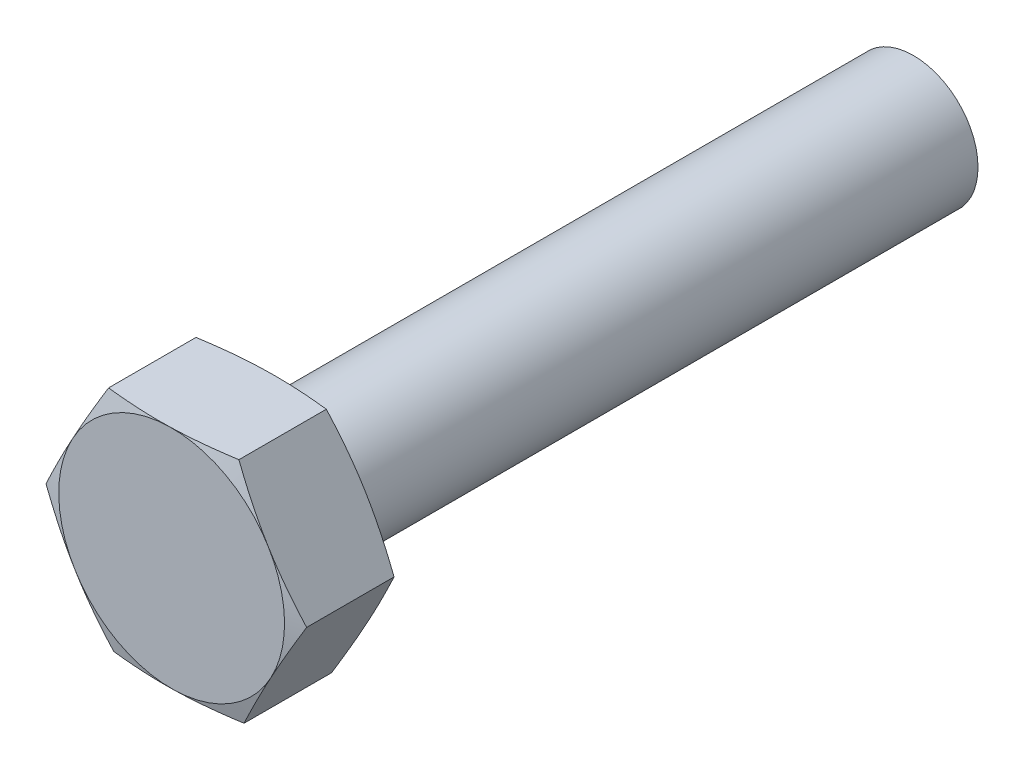
ISO-10303-21;
HEADER;
FILE_DESCRIPTION(('STEP AP214'),'2;1');
FILE_NAME('part.step','',(''),(''),'','','');
FILE_SCHEMA(('AUTOMOTIVE_DESIGN { 1 0 10303 214 1 1 1 1 }'));
ENDSEC;
DATA;
#1=APPLICATION_CONTEXT('core data for automotive mechanical design processes');
#2=APPLICATION_PROTOCOL_DEFINITION('international standard','automotive_design',2000,#1);
#3=PRODUCT_CONTEXT('',#1,'mechanical');
#4=PRODUCT('Part','Part','',(#3));
#5=PRODUCT_RELATED_PRODUCT_CATEGORY('part','',(#4));
#6=PRODUCT_DEFINITION_FORMATION('','',#4);
#7=PRODUCT_DEFINITION_CONTEXT('part definition',#1,'design');
#8=PRODUCT_DEFINITION('design','',#6,#7);
#9=PRODUCT_DEFINITION_SHAPE('','',#8);
#10=(LENGTH_UNIT() NAMED_UNIT(*) SI_UNIT(.MILLI.,.METRE.));
#11=(NAMED_UNIT(*) PLANE_ANGLE_UNIT() SI_UNIT($,.RADIAN.));
#12=(NAMED_UNIT(*) SI_UNIT($,.STERADIAN.) SOLID_ANGLE_UNIT());
#13=UNCERTAINTY_MEASURE_WITH_UNIT(LENGTH_MEASURE(1.E-05),#10,'distance_accuracy_value','');
#14=(GEOMETRIC_REPRESENTATION_CONTEXT(3) GLOBAL_UNCERTAINTY_ASSIGNED_CONTEXT((#13)) GLOBAL_UNIT_ASSIGNED_CONTEXT((#10,
#11,#12)) REPRESENTATION_CONTEXT('',''));
#15=CARTESIAN_POINT('',(0.,0.,0.));
#16=DIRECTION('',(0.,0.,1.));
#17=DIRECTION('',(1.,0.,0.));
#18=AXIS2_PLACEMENT_3D('',#15,#16,#17);
#19=CARTESIAN_POINT('',(8.08080770689294,0.184065579490314,6.));
#20=DIRECTION('',(-0.854414720895606,-0.519591651892988,0.));
#21=DIRECTION('',(0.519591651892988,-0.854414720895606,0.));
#22=AXIS2_PLACEMENT_3D('',#19,#20,#21);
#23=PLANE('',#22);
#24=CARTESIAN_POINT('',(3.88087676048176,7.09041754701151,0.290194551527086));
#25=CARTESIAN_POINT('',(4.05529437046429,6.80360583052305,0.245202710052973));
#26=CARTESIAN_POINT('',(4.23002821983213,6.51627409107973,0.204357539440146));
#27=CARTESIAN_POINT('',(4.58011300549116,5.94059587658397,0.132596400963437));
#28=CARTESIAN_POINT('',(4.75546416328202,5.65224903729823,0.101684466158914));
#29=CARTESIAN_POINT('',(5.10572040942748,5.07628887376975,0.0515944197333024));
#30=CARTESIAN_POINT('',(5.2806231293427,4.78867944418058,0.0323565735185512));
#31=CARTESIAN_POINT('',(5.6306516147403,4.21309380964059,0.00656059026824351));
#32=CARTESIAN_POINT('',(5.80577733050477,3.92511768644575,0.));
#33=CARTESIAN_POINT('',(6.15602876203372,3.34916544005607,0.));
#34=CARTESIAN_POINT('',(6.33115447779819,3.06118931686123,0.00656059026824355));
#35=CARTESIAN_POINT('',(6.68118296319579,2.48560368232125,0.0323565735185513));
#36=CARTESIAN_POINT('',(6.85608568311101,2.19799425273207,0.0515944197333025));
#37=CARTESIAN_POINT('',(7.20634192925647,1.6220340892036,0.101684466158914));
#38=CARTESIAN_POINT('',(7.38169308704733,1.33368724991786,0.132596400963438));
#39=CARTESIAN_POINT('',(7.73177787270636,0.758009035422094,0.204357539440147));
#40=CARTESIAN_POINT('',(7.9065117220742,0.470677295978776,0.245202710052973));
#41=CARTESIAN_POINT('',(8.08092933205673,0.183865579490314,0.290194551527086));
#42=B_SPLINE_CURVE_WITH_KNOTS('',3,(#24,#25,#26,#27,#28,#29,#30,#31,#32,#33,#34,#35,#36,#37,#38,
#39,#40,#41),.UNSPECIFIED.,.F.,.F.,(4,2,2,2,2,2,2,2,4),(0.,1.0161046930003,2.03262142170252,
3.04389193427785,4.05496673175253,5.06604152922721,6.07731204180254,7.09382877050475,
8.10993346350506),.UNSPECIFIED.);
#43=CARTESIAN_POINT('',(3.88099838564555,7.09021754701151,0.290163190291659));
#44=VERTEX_POINT('',#43);
#45=CARTESIAN_POINT('',(5.98090304626924,3.63714156325091,0.));
#46=VERTEX_POINT('',#45);
#47=EDGE_CURVE('E131',#44,#46,#42,.T.);
#48=ORIENTED_EDGE('',*,*,#47,.F.);
#49=DIRECTION('',(0.,0.,-1.));
#50=VECTOR('',#49,1.);
#51=CARTESIAN_POINT('',(3.88099838564555,7.09021754701151,6.));
#52=LINE('',#51,#50);
#53=CARTESIAN_POINT('',(3.88099838564555,7.09021754701151,5.70983680970834));
#54=VERTEX_POINT('',#53);
#55=EDGE_CURVE('E342',#54,#44,#52,.T.);
#56=ORIENTED_EDGE('',*,*,#55,.F.);
#57=CARTESIAN_POINT('',(8.08092933205673,0.183865579490314,5.70980544847291));
#58=CARTESIAN_POINT('',(7.9065117220742,0.470677295978775,5.75479728994703));
#59=CARTESIAN_POINT('',(7.73177787270636,0.758009035422094,5.79564246055985));
#60=CARTESIAN_POINT('',(7.38169308704733,1.33368724991785,5.86740359903656));
#61=CARTESIAN_POINT('',(7.20634192925647,1.6220340892036,5.89831553384109));
#62=CARTESIAN_POINT('',(6.85608568311101,2.19799425273207,5.9484055802667));
#63=CARTESIAN_POINT('',(6.68118296319579,2.48560368232125,5.96764342648145));
#64=CARTESIAN_POINT('',(6.33115447779819,3.06118931686123,5.99343940973176));
#65=CARTESIAN_POINT('',(6.15602876203372,3.34916544005607,6.));
#66=CARTESIAN_POINT('',(5.80577733050477,3.92511768644575,6.));
#67=CARTESIAN_POINT('',(5.6306516147403,4.21309380964059,5.99343940973176));
#68=CARTESIAN_POINT('',(5.2806231293427,4.78867944418058,5.96764342648145));
#69=CARTESIAN_POINT('',(5.10572040942748,5.07628887376975,5.9484055802667));
#70=CARTESIAN_POINT('',(4.75546416328202,5.65224903729823,5.89831553384109));
#71=CARTESIAN_POINT('',(4.58011300549116,5.94059587658397,5.86740359903656));
#72=CARTESIAN_POINT('',(4.23002821983213,6.51627409107973,5.79564246055985));
#73=CARTESIAN_POINT('',(4.05529437046429,6.80360583052305,5.75479728994703));
#74=CARTESIAN_POINT('',(3.88087676048176,7.09041754701151,5.70980544847291));
#75=B_SPLINE_CURVE_WITH_KNOTS('',3,(#57,#58,#59,#60,#61,#62,#63,#64,#65,#66,#67,#68,#69,#70,#71,
#72,#73,#74),.UNSPECIFIED.,.F.,.F.,(4,2,2,2,2,2,2,2,4),(0.,1.0161046930003,2.03262142170252,
3.04389193427785,4.05496673175253,5.06604152922721,6.07731204180254,7.09382877050475,
8.10993346350505),.UNSPECIFIED.);
#76=CARTESIAN_POINT('',(5.98090304626924,3.63714156325091,6.));
#77=VERTEX_POINT('',#76);
#78=EDGE_CURVE('E309',#77,#54,#75,.T.);
#79=ORIENTED_EDGE('',*,*,#78,.F.);
#80=CARTESIAN_POINT('',(8.08080770689294,0.184065579490314,5.70983680970834));
#81=VERTEX_POINT('',#80);
#82=EDGE_CURVE('E347',#81,#77,#75,.T.);
#83=ORIENTED_EDGE('',*,*,#82,.F.);
#84=DIRECTION('',(0.,0.,-1.));
#85=VECTOR('',#84,1.);
#86=CARTESIAN_POINT('',(8.08080770689294,0.184065579490314,6.));
#87=LINE('',#86,#85);
#88=CARTESIAN_POINT('',(8.08080770689294,0.184065579490314,0.290163190291659));
#89=VERTEX_POINT('',#88);
#90=EDGE_CURVE('E163',#81,#89,#87,.T.);
#91=ORIENTED_EDGE('',*,*,#90,.T.);
#92=EDGE_CURVE('E143',#46,#89,#42,.T.);
#93=ORIENTED_EDGE('',*,*,#92,.F.);
#94=EDGE_LOOP('',(#48,#56,#79,#83,#91,#93));
#95=FACE_BOUND('',#94,.T.);
#96=ADVANCED_FACE('F42',(#95),#23,.F.);
#97=CARTESIAN_POINT('',(3.88099838564555,7.09021754701151,6.));
#98=DIRECTION('',(0.0227722096858451,-0.999740679609479,0.));
#99=DIRECTION('',(0.99974067960948,0.0227722096858451,0.));
#100=AXIS2_PLACEMENT_3D('',#97,#98,#99);
#101=PLANE('',#100);
#102=CARTESIAN_POINT('',(-4.20000932124738,6.9061474118979,0.290189992658677));
#103=CARTESIAN_POINT('',(-3.86441709695318,6.91379157068471,0.245198811445108));
#104=CARTESIAN_POINT('',(-3.52821641045345,6.92144958909453,0.204354260750077));
#105=CARTESIAN_POINT('',(-2.85462773303434,6.93679267047258,0.132594236234794));
#106=CARTESIAN_POINT('',(-2.51723931595068,6.94447774314803,0.101682795305096));
#107=CARTESIAN_POINT('',(-1.84332073922359,6.95982833901096,0.0515935598155296));
#108=CARTESIAN_POINT('',(-1.50679513649752,6.96749375840044,0.0323560324237809));
#109=CARTESIAN_POINT('',(-0.833314781343614,6.98283437240132,0.00656047907592343));
#110=CARTESIAN_POINT('',(-0.496360124572264,6.99050956483384,0.));
#111=CARTESIAN_POINT('',(0.177549188970436,7.00585994969888,0.));
#112=CARTESIAN_POINT('',(0.514503845741786,7.01353514213139,0.00656047907592363));
#113=CARTESIAN_POINT('',(1.18798420089569,7.02887575613227,0.0323560324237812));
#114=CARTESIAN_POINT('',(1.52450980362176,7.03654117552175,0.0515935598155299));
#115=CARTESIAN_POINT('',(2.19842838034885,7.05189177138468,0.101682795305096));
#116=CARTESIAN_POINT('',(2.53581679743252,7.05957684406013,0.132594236234795));
#117=CARTESIAN_POINT('',(3.20940547485162,7.07491992543819,0.204354260750077));
#118=CARTESIAN_POINT('',(3.54560616135135,7.08257794384801,0.245198811445108));
#119=CARTESIAN_POINT('',(3.88119838564555,7.09022210263482,0.290189992658678));
#120=B_SPLINE_CURVE_WITH_KNOTS('',3,(#102,#103,#104,#105,#106,#107,#108,#109,#110,#111,#112,
#113,#114,#115,#116,#117,#118,#119),.UNSPECIFIED.,.F.,.F.,(4,2,2,2,2,2,2,2,4),(0.,
1.01609606043578,2.03260414107203,3.04386612701404,4.05493240530553,5.06599868359701,
6.07726066953902,7.09376875017528,8.10986481061106),.UNSPECIFIED.);
#121=CARTESIAN_POINT('',(-4.19980932124738,6.9061519675212,0.290163190291659));
#122=VERTEX_POINT('',#121);
#123=CARTESIAN_POINT('',(-0.159405467800916,6.99818475726636,0.));
#124=VERTEX_POINT('',#123);
#125=EDGE_CURVE('E57',#122,#124,#120,.T.);
#126=ORIENTED_EDGE('',*,*,#125,.F.);
#127=DIRECTION('',(0.,0.,-1.));
#128=VECTOR('',#127,1.);
#129=CARTESIAN_POINT('',(-4.19980932124738,6.9061519675212,6.));
#130=LINE('',#129,#128);
#131=CARTESIAN_POINT('',(-4.19980932124738,6.9061519675212,5.70983680970834));
#132=VERTEX_POINT('',#131);
#133=EDGE_CURVE('E305',#132,#122,#130,.T.);
#134=ORIENTED_EDGE('',*,*,#133,.F.);
#135=CARTESIAN_POINT('',(3.88119838564555,7.09022210263482,5.70981000734132));
#136=CARTESIAN_POINT('',(3.54560616135135,7.08257794384801,5.75480118855489));
#137=CARTESIAN_POINT('',(3.20940547485162,7.07491992543819,5.79564573924992));
#138=CARTESIAN_POINT('',(2.53581679743252,7.05957684406013,5.86740576376521));
#139=CARTESIAN_POINT('',(2.19842838034885,7.05189177138468,5.8983172046949));
#140=CARTESIAN_POINT('',(1.52450980362176,7.03654117552175,5.94840644018447));
#141=CARTESIAN_POINT('',(1.18798420089569,7.02887575613227,5.96764396757622));
#142=CARTESIAN_POINT('',(0.514503845741784,7.01353514213139,5.99343952092408));
#143=CARTESIAN_POINT('',(0.177549188970435,7.00585994969888,6.));
#144=CARTESIAN_POINT('',(-0.496360124572265,6.99050956483384,6.));
#145=CARTESIAN_POINT('',(-0.833314781343615,6.98283437240132,5.99343952092408));
#146=CARTESIAN_POINT('',(-1.50679513649752,6.96749375840044,5.96764396757622));
#147=CARTESIAN_POINT('',(-1.84332073922359,6.95982833901096,5.94840644018447));
#148=CARTESIAN_POINT('',(-2.51723931595068,6.94447774314803,5.89831720469491));
#149=CARTESIAN_POINT('',(-2.85462773303435,6.93679267047258,5.86740576376521));
#150=CARTESIAN_POINT('',(-3.52821641045345,6.92144958909453,5.79564573924992));
#151=CARTESIAN_POINT('',(-3.86441709695318,6.91379157068471,5.75480118855489));
#152=CARTESIAN_POINT('',(-4.20000932124738,6.9061474118979,5.70981000734132));
#153=B_SPLINE_CURVE_WITH_KNOTS('',3,(#135,#136,#137,#138,#139,#140,#141,#142,#143,#144,#145,
#146,#147,#148,#149,#150,#151,#152),.UNSPECIFIED.,.F.,.F.,(4,2,2,2,2,2,2,2,4),(0.,
1.01609606043578,2.03260414107203,3.04386612701404,4.05493240530553,5.06599868359701,
6.07726066953902,7.09376875017528,8.10986481061106),.UNSPECIFIED.);
#154=CARTESIAN_POINT('',(-0.159405467800916,6.99818475726636,6.));
#155=VERTEX_POINT('',#154);
#156=EDGE_CURVE('E271',#155,#132,#153,.T.);
#157=ORIENTED_EDGE('',*,*,#156,.F.);
#158=EDGE_CURVE('E303',#54,#155,#153,.T.);
#159=ORIENTED_EDGE('',*,*,#158,.F.);
#160=ORIENTED_EDGE('',*,*,#55,.T.);
#161=EDGE_CURVE('E137',#124,#44,#120,.T.);
#162=ORIENTED_EDGE('',*,*,#161,.F.);
#163=EDGE_LOOP('',(#126,#134,#157,#159,#160,#162));
#164=FACE_BOUND('',#163,.T.);
#165=ADVANCED_FACE('F264',(#164),#101,.F.);
#166=CARTESIAN_POINT('',(-4.19980932124738,6.9061519675212,6.));
#167=DIRECTION('',(0.877186930581451,-0.480149027716492,0.));
#168=DIRECTION('',(0.480149027716492,0.877186930581451,0.));
#169=AXIS2_PLACEMENT_3D('',#166,#167,#168);
#170=PLANE('',#169);
#171=CARTESIAN_POINT('',(-8.08091718162653,-0.184265579490316,0.290193737356568));
#172=CARTESIAN_POINT('',(-7.91973999533653,0.110189919032452,0.245202013798612));
#173=CARTESIAN_POINT('',(-7.7582705765569,0.405179298716682,0.204356953897157));
#174=CARTESIAN_POINT('',(-7.43476149786157,0.996199834789812,0.132596014363326));
#175=CARTESIAN_POINT('',(-7.27272163326219,1.29223136511644,0.101684167760161));
#176=CARTESIAN_POINT('',(-6.94905411029638,1.88354136390899,0.0515942661600595));
#177=CARTESIAN_POINT('',(-6.78742864056449,2.17881583394628,0.0323564768840994));
#178=CARTESIAN_POINT('',(-6.46397158794955,2.76974132328363,0.00656057041033378));
#179=CARTESIAN_POINT('',(-6.30214005100985,3.06539225864954,0.));
#180=CARTESIAN_POINT('',(-5.97847697713046,3.65669412938135,0.));
#181=CARTESIAN_POINT('',(-5.81664544019076,3.95234506474726,0.00656057041033374));
#182=CARTESIAN_POINT('',(-5.49318838757583,4.5432705540846,0.0323564768840995));
#183=CARTESIAN_POINT('',(-5.33156291784393,4.8385450241219,0.0515942661600598));
#184=CARTESIAN_POINT('',(-5.00789539487812,5.42985502291444,0.101684167760162));
#185=CARTESIAN_POINT('',(-4.84585553027875,5.72588655324107,0.132596014363327));
#186=CARTESIAN_POINT('',(-4.52234645158341,6.3169070893142,0.204356953897158));
#187=CARTESIAN_POINT('',(-4.36087703280378,6.61189646899843,0.245202013798612));
#188=CARTESIAN_POINT('',(-4.19969984651378,6.9063519675212,0.290193737356568));
#189=B_SPLINE_CURVE_WITH_KNOTS('',3,(#171,#172,#173,#174,#175,#176,#177,#178,#179,#180,#181,
#182,#183,#184,#185,#186,#187,#188),.UNSPECIFIED.,.F.,.F.,(4,2,2,2,2,2,2,2,4),(0.,
1.01610315131031,2.0326183355541,3.04388732535778,4.05496060139135,5.06603387742492,
6.0773028672286,7.09381805147239,8.1099212027827),.UNSPECIFIED.);
#190=CARTESIAN_POINT('',(-8.08080770689293,-0.184065579490316,0.290163190291659));
#191=VERTEX_POINT('',#190);
#192=CARTESIAN_POINT('',(-6.14030851407016,3.36104319401544,0.));
#193=VERTEX_POINT('',#192);
#194=EDGE_CURVE('E65',#191,#193,#189,.T.);
#195=ORIENTED_EDGE('',*,*,#194,.F.);
#196=DIRECTION('',(0.,0.,-1.));
#197=VECTOR('',#196,1.);
#198=CARTESIAN_POINT('',(-8.08080770689293,-0.184065579490316,6.));
#199=LINE('',#198,#197);
#200=CARTESIAN_POINT('',(-8.08080770689293,-0.184065579490316,5.70983680970834));
#201=VERTEX_POINT('',#200);
#202=EDGE_CURVE('E333',#201,#191,#199,.T.);
#203=ORIENTED_EDGE('',*,*,#202,.F.);
#204=CARTESIAN_POINT('',(-4.19969984651378,6.9063519675212,5.70980626264343));
#205=CARTESIAN_POINT('',(-4.36087703280378,6.61189646899843,5.75479798620139));
#206=CARTESIAN_POINT('',(-4.52234645158341,6.3169070893142,5.79564304610284));
#207=CARTESIAN_POINT('',(-4.84585553027875,5.72588655324107,5.86740398563667));
#208=CARTESIAN_POINT('',(-5.00789539487812,5.42985502291444,5.89831583223984));
#209=CARTESIAN_POINT('',(-5.33156291784393,4.83854502412189,5.94840573383994));
#210=CARTESIAN_POINT('',(-5.49318838757583,4.5432705540846,5.9676435231159));
#211=CARTESIAN_POINT('',(-5.81664544019076,3.95234506474726,5.99343942958967));
#212=CARTESIAN_POINT('',(-5.97847697713046,3.65669412938135,6.));
#213=CARTESIAN_POINT('',(-6.30214005100985,3.06539225864953,6.));
#214=CARTESIAN_POINT('',(-6.46397158794955,2.76974132328363,5.99343942958967));
#215=CARTESIAN_POINT('',(-6.78742864056449,2.17881583394628,5.9676435231159));
#216=CARTESIAN_POINT('',(-6.94905411029638,1.88354136390899,5.94840573383994));
#217=CARTESIAN_POINT('',(-7.27272163326219,1.29223136511644,5.89831583223984));
#218=CARTESIAN_POINT('',(-7.43476149786157,0.996199834789812,5.86740398563667));
#219=CARTESIAN_POINT('',(-7.7582705765569,0.405179298716681,5.79564304610284));
#220=CARTESIAN_POINT('',(-7.91973999533653,0.110189919032452,5.75479798620139));
#221=CARTESIAN_POINT('',(-8.08091718162653,-0.184265579490317,5.70980626264343));
#222=B_SPLINE_CURVE_WITH_KNOTS('',3,(#204,#205,#206,#207,#208,#209,#210,#211,#212,#213,#214,
#215,#216,#217,#218,#219,#220,#221),.UNSPECIFIED.,.F.,.F.,(4,2,2,2,2,2,2,2,4),(0.,
1.01610315131031,2.0326183355541,3.04388732535778,4.05496060139135,5.06603387742492,
6.0773028672286,7.09381805147239,8.1099212027827),.UNSPECIFIED.);
#223=CARTESIAN_POINT('',(-6.14030851407016,3.36104319401544,6.));
#224=VERTEX_POINT('',#223);
#225=EDGE_CURVE('E250',#224,#201,#222,.T.);
#226=ORIENTED_EDGE('',*,*,#225,.F.);
#227=EDGE_CURVE('E308',#132,#224,#222,.T.);
#228=ORIENTED_EDGE('',*,*,#227,.F.);
#229=ORIENTED_EDGE('',*,*,#133,.T.);
#230=EDGE_CURVE('E201',#193,#122,#189,.T.);
#231=ORIENTED_EDGE('',*,*,#230,.F.);
#232=EDGE_LOOP('',(#195,#203,#226,#228,#229,#231));
#233=FACE_BOUND('',#232,.T.);
#234=ADVANCED_FACE('F259',(#233),#170,.F.);
#235=CARTESIAN_POINT('',(-8.08080770689293,-0.184065579490316,6.));
#236=DIRECTION('',(0.854414720895606,0.519591651892988,0.));
#237=DIRECTION('',(-0.519591651892988,0.854414720895606,0.));
#238=AXIS2_PLACEMENT_3D('',#235,#236,#237);
#239=PLANE('',#238);
#240=CARTESIAN_POINT('',(-3.88087676048175,-7.09041754701152,0.290194551527086));
#241=CARTESIAN_POINT('',(-4.05529437046428,-6.80360583052305,0.245202710052973));
#242=CARTESIAN_POINT('',(-4.23002821983212,-6.51627409107974,0.204357539440146));
#243=CARTESIAN_POINT('',(-4.58011300549115,-5.94059587658398,0.132596400963437));
#244=CARTESIAN_POINT('',(-4.75546416328201,-5.65224903729824,0.101684466158914));
#245=CARTESIAN_POINT('',(-5.10572040942748,-5.07628887376976,0.0515944197333021));
#246=CARTESIAN_POINT('',(-5.28062312934269,-4.78867944418058,0.0323565735185508));
#247=CARTESIAN_POINT('',(-5.63065161474029,-4.2130938096406,0.00656059026824295));
#248=CARTESIAN_POINT('',(-5.80577733050476,-3.92511768644576,0.));
#249=CARTESIAN_POINT('',(-6.15602876203371,-3.34916544005608,0.));
#250=CARTESIAN_POINT('',(-6.33115447779818,-3.06118931686124,0.00656059026824281));
#251=CARTESIAN_POINT('',(-6.68118296319579,-2.48560368232125,0.0323565735185504));
#252=CARTESIAN_POINT('',(-6.856085683111,-2.19799425273208,0.0515944197333014));
#253=CARTESIAN_POINT('',(-7.20634192925646,-1.6220340892036,0.101684466158913));
#254=CARTESIAN_POINT('',(-7.38169308704732,-1.33368724991786,0.132596400963437));
#255=CARTESIAN_POINT('',(-7.73177787270635,-0.758009035422099,0.204357539440146));
#256=CARTESIAN_POINT('',(-7.9065117220742,-0.470677295978781,0.245202710052972));
#257=CARTESIAN_POINT('',(-8.08092933205673,-0.183865579490318,0.290194551527085));
#258=B_SPLINE_CURVE_WITH_KNOTS('',3,(#240,#241,#242,#243,#244,#245,#246,#247,#248,#249,#250,
#251,#252,#253,#254,#255,#256,#257),.UNSPECIFIED.,.F.,.F.,(4,2,2,2,2,2,2,2,4),(0.,
1.0161046930003,2.03262142170252,3.04389193427784,4.05496673175253,5.06604152922721,
6.07731204180254,7.09382877050475,8.10993346350506),.UNSPECIFIED.);
#259=CARTESIAN_POINT('',(-3.88099838564555,-7.09021754701152,0.290163190291659));
#260=VERTEX_POINT('',#259);
#261=CARTESIAN_POINT('',(-5.98090304626924,-3.63714156325092,0.));
#262=VERTEX_POINT('',#261);
#263=EDGE_CURVE('E178',#260,#262,#258,.T.);
#264=ORIENTED_EDGE('',*,*,#263,.F.);
#265=DIRECTION('',(0.,0.,-1.));
#266=VECTOR('',#265,1.);
#267=CARTESIAN_POINT('',(-3.88099838564555,-7.09021754701152,6.));
#268=LINE('',#267,#266);
#269=CARTESIAN_POINT('',(-3.88099838564555,-7.09021754701152,5.70983680970834));
#270=VERTEX_POINT('',#269);
#271=EDGE_CURVE('E330',#270,#260,#268,.T.);
#272=ORIENTED_EDGE('',*,*,#271,.F.);
#273=CARTESIAN_POINT('',(-8.08092933205673,-0.183865579490316,5.70980544847291));
#274=CARTESIAN_POINT('',(-7.9065117220742,-0.470677295978778,5.75479728994703));
#275=CARTESIAN_POINT('',(-7.73177787270636,-0.758009035422097,5.79564246055985));
#276=CARTESIAN_POINT('',(-7.38169308704733,-1.33368724991786,5.86740359903656));
#277=CARTESIAN_POINT('',(-7.20634192925646,-1.6220340892036,5.89831553384109));
#278=CARTESIAN_POINT('',(-6.856085683111,-2.19799425273208,5.9484055802667));
#279=CARTESIAN_POINT('',(-6.68118296319579,-2.48560368232125,5.96764342648145));
#280=CARTESIAN_POINT('',(-6.33115447779819,-3.06118931686124,5.99343940973176));
#281=CARTESIAN_POINT('',(-6.15602876203371,-3.34916544005608,6.));
#282=CARTESIAN_POINT('',(-5.80577733050477,-3.92511768644576,6.));
#283=CARTESIAN_POINT('',(-5.63065161474029,-4.2130938096406,5.99343940973176));
#284=CARTESIAN_POINT('',(-5.28062312934269,-4.78867944418058,5.96764342648145));
#285=CARTESIAN_POINT('',(-5.10572040942748,-5.07628887376975,5.9484055802667));
#286=CARTESIAN_POINT('',(-4.75546416328201,-5.65224903729823,5.89831553384109));
#287=CARTESIAN_POINT('',(-4.58011300549115,-5.94059587658397,5.86740359903656));
#288=CARTESIAN_POINT('',(-4.23002821983212,-6.51627409107973,5.79564246055985));
#289=CARTESIAN_POINT('',(-4.05529437046428,-6.80360583052305,5.75479728994703));
#290=CARTESIAN_POINT('',(-3.88087676048175,-7.09041754701151,5.70980544847291));
#291=B_SPLINE_CURVE_WITH_KNOTS('',3,(#273,#274,#275,#276,#277,#278,#279,#280,#281,#282,#283,
#284,#285,#286,#287,#288,#289,#290),.UNSPECIFIED.,.F.,.F.,(4,2,2,2,2,2,2,2,4),(0.,
1.0161046930003,2.03262142170252,3.04389193427785,4.05496673175253,5.06604152922721,
6.07731204180254,7.09382877050475,8.10993346350506),.UNSPECIFIED.);
#292=CARTESIAN_POINT('',(-5.98090304626924,-3.63714156325092,6.));
#293=VERTEX_POINT('',#292);
#294=EDGE_CURVE('E243',#293,#270,#291,.T.);
#295=ORIENTED_EDGE('',*,*,#294,.F.);
#296=EDGE_CURVE('E249',#201,#293,#291,.T.);
#297=ORIENTED_EDGE('',*,*,#296,.F.);
#298=ORIENTED_EDGE('',*,*,#202,.T.);
#299=EDGE_CURVE('E281',#262,#191,#258,.T.);
#300=ORIENTED_EDGE('',*,*,#299,.F.);
#301=EDGE_LOOP('',(#264,#272,#295,#297,#298,#300));
#302=FACE_BOUND('',#301,.T.);
#303=ADVANCED_FACE('F256',(#302),#239,.F.);
#304=CARTESIAN_POINT('',(-3.88099838564555,-7.09021754701152,6.));
#305=DIRECTION('',(-0.0227722096858456,0.999740679609479,0.));
#306=DIRECTION('',(-0.99974067960948,-0.0227722096858456,0.));
#307=AXIS2_PLACEMENT_3D('',#304,#305,#306);
#308=PLANE('',#307);
#309=CARTESIAN_POINT('',(4.20000932124738,-6.9061474118979,0.290189992658677));
#310=CARTESIAN_POINT('',(3.86441709695318,-6.9137915706847,0.245198811445108));
#311=CARTESIAN_POINT('',(3.52821641045345,-6.92144958909453,0.204354260750077));
#312=CARTESIAN_POINT('',(2.85462773303435,-6.93679267047258,0.132594236234795));
#313=CARTESIAN_POINT('',(2.51723931595068,-6.94447774314803,0.101682795305096));
#314=CARTESIAN_POINT('',(1.84332073922359,-6.95982833901096,0.0515935598155301));
#315=CARTESIAN_POINT('',(1.50679513649752,-6.96749375840045,0.0323560324237815));
#316=CARTESIAN_POINT('',(0.833314781343617,-6.98283437240132,0.00656047907592399));
#317=CARTESIAN_POINT('',(0.496360124572267,-6.99050956483384,0.));
#318=CARTESIAN_POINT('',(-0.177549188970432,-7.00585994969888,0.));
#319=CARTESIAN_POINT('',(-0.514503845741782,-7.01353514213139,0.00656047907592402));
#320=CARTESIAN_POINT('',(-1.18798420089569,-7.02887575613227,0.0323560324237815));
#321=CARTESIAN_POINT('',(-1.52450980362176,-7.03654117552175,0.0515935598155301));
#322=CARTESIAN_POINT('',(-2.19842838034885,-7.05189177138468,0.101682795305096));
#323=CARTESIAN_POINT('',(-2.53581679743251,-7.05957684406014,0.132594236234795));
#324=CARTESIAN_POINT('',(-3.20940547485161,-7.07491992543819,0.204354260750078));
#325=CARTESIAN_POINT('',(-3.54560616135135,-7.08257794384801,0.245198811445108));
#326=CARTESIAN_POINT('',(-3.88119838564555,-7.09022210263482,0.290189992658678));
#327=B_SPLINE_CURVE_WITH_KNOTS('',3,(#309,#310,#311,#312,#313,#314,#315,#316,#317,#318,#319,
#320,#321,#322,#323,#324,#325,#326),.UNSPECIFIED.,.F.,.F.,(4,2,2,2,2,2,2,2,4),(0.,
1.01609606043578,2.03260414107203,3.04386612701404,4.05493240530553,5.06599868359701,
6.07726066953902,7.09376875017527,8.10986481061105),.UNSPECIFIED.);
#328=CARTESIAN_POINT('',(4.19980932124738,-6.9061519675212,0.290163190291659));
#329=VERTEX_POINT('',#328);
#330=CARTESIAN_POINT('',(0.159405467800919,-6.99818475726636,0.));
#331=VERTEX_POINT('',#330);
#332=EDGE_CURVE('E164',#329,#331,#327,.T.);
#333=ORIENTED_EDGE('',*,*,#332,.F.);
#334=DIRECTION('',(0.,0.,-1.));
#335=VECTOR('',#334,1.);
#336=CARTESIAN_POINT('',(4.19980932124738,-6.9061519675212,6.));
#337=LINE('',#336,#335);
#338=CARTESIAN_POINT('',(4.19980932124738,-6.9061519675212,5.70983680970834));
#339=VERTEX_POINT('',#338);
#340=EDGE_CURVE('E334',#339,#329,#337,.T.);
#341=ORIENTED_EDGE('',*,*,#340,.F.);
#342=CARTESIAN_POINT('',(-3.88119838564555,-7.09022210263482,5.70981000734132));
#343=CARTESIAN_POINT('',(-3.54560616135135,-7.08257794384801,5.75480118855489));
#344=CARTESIAN_POINT('',(-3.20940547485161,-7.07491992543819,5.79564573924992));
#345=CARTESIAN_POINT('',(-2.53581679743251,-7.05957684406014,5.86740576376521));
#346=CARTESIAN_POINT('',(-2.19842838034884,-7.05189177138468,5.8983172046949));
#347=CARTESIAN_POINT('',(-1.52450980362176,-7.03654117552175,5.94840644018447));
#348=CARTESIAN_POINT('',(-1.18798420089568,-7.02887575613227,5.96764396757622));
#349=CARTESIAN_POINT('',(-0.51450384574178,-7.01353514213139,5.99343952092408));
#350=CARTESIAN_POINT('',(-0.17754918897043,-7.00585994969888,6.));
#351=CARTESIAN_POINT('',(0.49636012457227,-6.99050956483384,6.));
#352=CARTESIAN_POINT('',(0.83331478134362,-6.98283437240132,5.99343952092408));
#353=CARTESIAN_POINT('',(1.50679513649752,-6.96749375840045,5.96764396757622));
#354=CARTESIAN_POINT('',(1.84332073922359,-6.95982833901096,5.94840644018447));
#355=CARTESIAN_POINT('',(2.51723931595068,-6.94447774314803,5.8983172046949));
#356=CARTESIAN_POINT('',(2.85462773303435,-6.93679267047258,5.86740576376521));
#357=CARTESIAN_POINT('',(3.52821641045345,-6.92144958909453,5.79564573924992));
#358=CARTESIAN_POINT('',(3.86441709695319,-6.9137915706847,5.75480118855489));
#359=CARTESIAN_POINT('',(4.20000932124739,-6.9061474118979,5.70981000734132));
#360=B_SPLINE_CURVE_WITH_KNOTS('',3,(#342,#343,#344,#345,#346,#347,#348,#349,#350,#351,#352,
#353,#354,#355,#356,#357,#358,#359),.UNSPECIFIED.,.F.,.F.,(4,2,2,2,2,2,2,2,4),(0.,
1.01609606043578,2.03260414107203,3.04386612701404,4.05493240530553,5.06599868359701,
6.07726066953902,7.09376875017527,8.10986481061105),.UNSPECIFIED.);
#361=CARTESIAN_POINT('',(0.159405467800919,-6.99818475726636,6.));
#362=VERTEX_POINT('',#361);
#363=EDGE_CURVE('E236',#362,#339,#360,.T.);
#364=ORIENTED_EDGE('',*,*,#363,.F.);
#365=EDGE_CURVE('E242',#270,#362,#360,.T.);
#366=ORIENTED_EDGE('',*,*,#365,.F.);
#367=ORIENTED_EDGE('',*,*,#271,.T.);
#368=EDGE_CURVE('E142',#331,#260,#327,.T.);
#369=ORIENTED_EDGE('',*,*,#368,.F.);
#370=EDGE_LOOP('',(#333,#341,#364,#366,#367,#369));
#371=FACE_BOUND('',#370,.T.);
#372=ADVANCED_FACE('F223',(#371),#308,.F.);
#373=CARTESIAN_POINT('',(4.19980932124738,-6.9061519675212,6.));
#374=DIRECTION('',(-0.877186930581451,0.480149027716492,0.));
#375=DIRECTION('',(-0.480149027716492,-0.877186930581451,0.));
#376=AXIS2_PLACEMENT_3D('',#373,#374,#375);
#377=PLANE('',#376);
#378=CARTESIAN_POINT('',(8.08091718162654,0.184265579490314,0.290193737356569));
#379=CARTESIAN_POINT('',(7.91973999533653,-0.110189919032455,0.245202013798613));
#380=CARTESIAN_POINT('',(7.7582705765569,-0.405179298716683,0.204356953897158));
#381=CARTESIAN_POINT('',(7.43476149786157,-0.996199834789814,0.132596014363327));
#382=CARTESIAN_POINT('',(7.2727216332622,-1.29223136511645,0.101684167760162));
#383=CARTESIAN_POINT('',(6.94905411029639,-1.88354136390899,0.0515942661600603));
#384=CARTESIAN_POINT('',(6.78742864056449,-2.17881583394628,0.0323564768841004));
#385=CARTESIAN_POINT('',(6.46397158794955,-2.76974132328363,0.00656057041033466));
#386=CARTESIAN_POINT('',(6.30214005100986,-3.06539225864954,0.));
#387=CARTESIAN_POINT('',(5.97847697713046,-3.65669412938135,0.));
#388=CARTESIAN_POINT('',(5.81664544019077,-3.95234506474726,0.00656057041033454));
#389=CARTESIAN_POINT('',(5.49318838757583,-4.5432705540846,0.0323564768841003));
#390=CARTESIAN_POINT('',(5.33156291784393,-4.8385450241219,0.0515942661600604));
#391=CARTESIAN_POINT('',(5.00789539487812,-5.42985502291444,0.101684167760162));
#392=CARTESIAN_POINT('',(4.84585553027875,-5.72588655324107,0.132596014363327));
#393=CARTESIAN_POINT('',(4.52234645158341,-6.3169070893142,0.204356953897158));
#394=CARTESIAN_POINT('',(4.36087703280378,-6.61189646899843,0.245202013798612));
#395=CARTESIAN_POINT('',(4.19969984651378,-6.9063519675212,0.290193737356569));
#396=B_SPLINE_CURVE_WITH_KNOTS('',3,(#378,#379,#380,#381,#382,#383,#384,#385,#386,#387,#388,
#389,#390,#391,#392,#393,#394,#395),.UNSPECIFIED.,.F.,.F.,(4,2,2,2,2,2,2,2,4),(0.,
1.01610315131031,2.0326183355541,3.04388732535778,4.05496060139135,5.06603387742492,
6.0773028672286,7.09381805147239,8.1099212027827),.UNSPECIFIED.);
#397=CARTESIAN_POINT('',(6.14030851407016,-3.36104319401544,0.));
#398=VERTEX_POINT('',#397);
#399=EDGE_CURVE('E150',#89,#398,#396,.T.);
#400=ORIENTED_EDGE('',*,*,#399,.F.);
#401=ORIENTED_EDGE('',*,*,#90,.F.);
#402=CARTESIAN_POINT('',(4.19969984651378,-6.9063519675212,5.70980626264343));
#403=CARTESIAN_POINT('',(4.36087703280379,-6.61189646899843,5.75479798620139));
#404=CARTESIAN_POINT('',(4.52234645158341,-6.3169070893142,5.79564304610284));
#405=CARTESIAN_POINT('',(4.84585553027875,-5.72588655324107,5.86740398563667));
#406=CARTESIAN_POINT('',(5.00789539487812,-5.42985502291444,5.89831583223984));
#407=CARTESIAN_POINT('',(5.33156291784393,-4.8385450241219,5.94840573383994));
#408=CARTESIAN_POINT('',(5.49318838757583,-4.5432705540846,5.9676435231159));
#409=CARTESIAN_POINT('',(5.81664544019077,-3.95234506474726,5.99343942958967));
#410=CARTESIAN_POINT('',(5.97847697713046,-3.65669412938135,6.));
#411=CARTESIAN_POINT('',(6.30214005100986,-3.06539225864953,6.));
#412=CARTESIAN_POINT('',(6.46397158794955,-2.76974132328363,5.99343942958967));
#413=CARTESIAN_POINT('',(6.78742864056449,-2.17881583394628,5.9676435231159));
#414=CARTESIAN_POINT('',(6.94905411029639,-1.88354136390899,5.94840573383994));
#415=CARTESIAN_POINT('',(7.2727216332622,-1.29223136511644,5.89831583223984));
#416=CARTESIAN_POINT('',(7.43476149786157,-0.996199834789812,5.86740398563667));
#417=CARTESIAN_POINT('',(7.75827057655691,-0.405179298716681,5.79564304610284));
#418=CARTESIAN_POINT('',(7.91973999533654,-0.110189919032452,5.75479798620139));
#419=CARTESIAN_POINT('',(8.08091718162654,0.184265579490317,5.70980626264343));
#420=B_SPLINE_CURVE_WITH_KNOTS('',3,(#402,#403,#404,#405,#406,#407,#408,#409,#410,#411,#412,
#413,#414,#415,#416,#417,#418,#419),.UNSPECIFIED.,.F.,.F.,(4,2,2,2,2,2,2,2,4),(0.,
1.01610315131031,2.0326183355541,3.04388732535778,4.05496060139135,5.06603387742492,
6.0773028672286,7.09381805147239,8.1099212027827),.UNSPECIFIED.);
#421=CARTESIAN_POINT('',(6.14030851407016,-3.36104319401544,6.));
#422=VERTEX_POINT('',#421);
#423=EDGE_CURVE('E228',#422,#81,#420,.T.);
#424=ORIENTED_EDGE('',*,*,#423,.F.);
#425=EDGE_CURVE('E234',#339,#422,#420,.T.);
#426=ORIENTED_EDGE('',*,*,#425,.F.);
#427=ORIENTED_EDGE('',*,*,#340,.T.);
#428=EDGE_CURVE('E210',#398,#329,#396,.T.);
#429=ORIENTED_EDGE('',*,*,#428,.F.);
#430=EDGE_LOOP('',(#400,#401,#424,#426,#427,#429));
#431=FACE_BOUND('',#430,.T.);
#432=ADVANCED_FACE('F219',(#431),#377,.F.);
#433=CARTESIAN_POINT('',(0.,0.,6.));
#434=DIRECTION('',(0.,0.,-1.));
#435=DIRECTION('',(1.,0.,0.));
#436=AXIS2_PLACEMENT_3D('',#433,#434,#435);
#437=CONICAL_SURFACE('',#436,7.,1.30899693899575);
#438=ORIENTED_EDGE('',*,*,#82,.T.);
#439=CARTESIAN_POINT('',(0.,0.,6.));
#440=DIRECTION('',(0.,0.,1.));
#441=DIRECTION('',(1.,0.,0.));
#442=AXIS2_PLACEMENT_3D('',#439,#440,#441);
#443=CIRCLE('',#442,7.);
#444=EDGE_CURVE('E297',#422,#77,#443,.T.);
#445=ORIENTED_EDGE('',*,*,#444,.F.);
#446=ORIENTED_EDGE('',*,*,#423,.T.);
#447=EDGE_LOOP('',(#438,#445,#446));
#448=FACE_BOUND('',#447,.T.);
#449=ADVANCED_FACE('F195',(#448),#437,.T.);
#450=ORIENTED_EDGE('',*,*,#363,.T.);
#451=ORIENTED_EDGE('',*,*,#425,.T.);
#452=EDGE_CURVE('E326',#362,#422,#443,.T.);
#453=ORIENTED_EDGE('',*,*,#452,.F.);
#454=EDGE_LOOP('',(#450,#451,#453));
#455=FACE_BOUND('',#454,.T.);
#456=ADVANCED_FACE('F349',(#455),#437,.T.);
#457=ORIENTED_EDGE('',*,*,#294,.T.);
#458=ORIENTED_EDGE('',*,*,#365,.T.);
#459=EDGE_CURVE('E321',#293,#362,#443,.T.);
#460=ORIENTED_EDGE('',*,*,#459,.F.);
#461=EDGE_LOOP('',(#457,#458,#460));
#462=FACE_BOUND('',#461,.T.);
#463=ADVANCED_FACE('F322',(#462),#437,.T.);
#464=ORIENTED_EDGE('',*,*,#225,.T.);
#465=ORIENTED_EDGE('',*,*,#296,.T.);
#466=EDGE_CURVE('E315',#224,#293,#443,.T.);
#467=ORIENTED_EDGE('',*,*,#466,.F.);
#468=EDGE_LOOP('',(#464,#465,#467));
#469=FACE_BOUND('',#468,.T.);
#470=ADVANCED_FACE('F314',(#469),#437,.T.);
#471=ORIENTED_EDGE('',*,*,#156,.T.);
#472=ORIENTED_EDGE('',*,*,#227,.T.);
#473=EDGE_CURVE('E155',#155,#224,#443,.T.);
#474=ORIENTED_EDGE('',*,*,#473,.F.);
#475=EDGE_LOOP('',(#471,#472,#474));
#476=FACE_BOUND('',#475,.T.);
#477=ADVANCED_FACE('F357',(#476),#437,.T.);
#478=ORIENTED_EDGE('',*,*,#78,.T.);
#479=ORIENTED_EDGE('',*,*,#158,.T.);
#480=CARTESIAN_POINT('',(0.,0.,6.));
#481=DIRECTION('',(0.,0.,1.));
#482=DIRECTION('',(1.,0.,0.));
#483=AXIS2_PLACEMENT_3D('',#480,#481,#482);
#484=CIRCLE('',#483,7.);
#485=EDGE_CURVE('E235',#77,#155,#484,.T.);
#486=ORIENTED_EDGE('',*,*,#485,.F.);
#487=EDGE_LOOP('',(#478,#479,#486));
#488=FACE_BOUND('',#487,.T.);
#489=ADVANCED_FACE('F356',(#488),#437,.T.);
#490=CARTESIAN_POINT('',(0.,0.,6.));
#491=DIRECTION('',(0.,0.,1.));
#492=DIRECTION('',(1.,0.,0.));
#493=AXIS2_PLACEMENT_3D('',#490,#491,#492);
#494=PLANE('',#493);
#495=ORIENTED_EDGE('',*,*,#444,.T.);
#496=ORIENTED_EDGE('',*,*,#485,.T.);
#497=ORIENTED_EDGE('',*,*,#473,.T.);
#498=ORIENTED_EDGE('',*,*,#466,.T.);
#499=ORIENTED_EDGE('',*,*,#459,.T.);
#500=ORIENTED_EDGE('',*,*,#452,.T.);
#501=EDGE_LOOP('',(#495,#496,#497,#498,#499,#500));
#502=FACE_BOUND('',#501,.T.);
#503=ADVANCED_FACE('F292',(#502),#494,.T.);
#504=CARTESIAN_POINT('',(0.,0.,0.));
#505=DIRECTION('',(0.,0.,1.));
#506=DIRECTION('',(-1.,0.,0.));
#507=AXIS2_PLACEMENT_3D('',#504,#505,#506);
#508=CONICAL_SURFACE('',#507,7.,1.30899693899575);
#509=ORIENTED_EDGE('',*,*,#92,.T.);
#510=ORIENTED_EDGE('',*,*,#399,.T.);
#511=CARTESIAN_POINT('',(0.,0.,0.));
#512=DIRECTION('',(0.,0.,1.));
#513=DIRECTION('',(1.,0.,0.));
#514=AXIS2_PLACEMENT_3D('',#511,#512,#513);
#515=CIRCLE('',#514,7.);
#516=EDGE_CURVE('E147',#398,#46,#515,.T.);
#517=ORIENTED_EDGE('',*,*,#516,.T.);
#518=EDGE_LOOP('',(#509,#510,#517));
#519=FACE_BOUND('',#518,.T.);
#520=ADVANCED_FACE('F148',(#519),#508,.T.);
#521=ORIENTED_EDGE('',*,*,#332,.T.);
#522=EDGE_CURVE('E154',#331,#398,#515,.T.);
#523=ORIENTED_EDGE('',*,*,#522,.T.);
#524=ORIENTED_EDGE('',*,*,#428,.T.);
#525=EDGE_LOOP('',(#521,#523,#524));
#526=FACE_BOUND('',#525,.T.);
#527=ADVANCED_FACE('F192',(#526),#508,.T.);
#528=ORIENTED_EDGE('',*,*,#263,.T.);
#529=EDGE_CURVE('E517',#262,#331,#515,.T.);
#530=ORIENTED_EDGE('',*,*,#529,.T.);
#531=ORIENTED_EDGE('',*,*,#368,.T.);
#532=EDGE_LOOP('',(#528,#530,#531));
#533=FACE_BOUND('',#532,.T.);
#534=ADVANCED_FACE('F191',(#533),#508,.T.);
#535=ORIENTED_EDGE('',*,*,#194,.T.);
#536=EDGE_CURVE('E159',#193,#262,#515,.T.);
#537=ORIENTED_EDGE('',*,*,#536,.T.);
#538=ORIENTED_EDGE('',*,*,#299,.T.);
#539=EDGE_LOOP('',(#535,#537,#538));
#540=FACE_BOUND('',#539,.T.);
#541=ADVANCED_FACE('F185',(#540),#508,.T.);
#542=ORIENTED_EDGE('',*,*,#230,.T.);
#543=ORIENTED_EDGE('',*,*,#125,.T.);
#544=CARTESIAN_POINT('',(0.,0.,0.));
#545=DIRECTION('',(0.,0.,-1.));
#546=DIRECTION('',(-1.,0.,0.));
#547=AXIS2_PLACEMENT_3D('',#544,#545,#546);
#548=CIRCLE('',#547,7.);
#549=EDGE_CURVE('E158',#193,#124,#548,.T.);
#550=ORIENTED_EDGE('',*,*,#549,.F.);
#551=EDGE_LOOP('',(#542,#543,#550));
#552=FACE_BOUND('',#551,.T.);
#553=ADVANCED_FACE('F190',(#552),#508,.T.);
#554=ORIENTED_EDGE('',*,*,#161,.T.);
#555=ORIENTED_EDGE('',*,*,#47,.T.);
#556=EDGE_CURVE('E50',#46,#124,#515,.T.);
#557=ORIENTED_EDGE('',*,*,#556,.T.);
#558=EDGE_LOOP('',(#554,#555,#557));
#559=FACE_BOUND('',#558,.T.);
#560=ADVANCED_FACE('F133',(#559),#508,.T.);
#561=CARTESIAN_POINT('',(0.,0.,0.));
#562=DIRECTION('',(0.,0.,1.));
#563=DIRECTION('',(1.,0.,0.));
#564=AXIS2_PLACEMENT_3D('',#561,#562,#563);
#565=PLANE('',#564);
#566=CARTESIAN_POINT('',(0.,0.,0.));
#567=DIRECTION('',(0.,0.,1.));
#568=DIRECTION('',(1.,0.,0.));
#569=AXIS2_PLACEMENT_3D('',#566,#567,#568);
#570=CIRCLE('',#569,4.);
#571=CARTESIAN_POINT('',(4.,0.,0.));
#572=VERTEX_POINT('',#571);
#573=EDGE_CURVE('E12',#572,#572,#570,.F.);
#574=ORIENTED_EDGE('',*,*,#573,.F.);
#575=EDGE_LOOP('',(#574));
#576=FACE_BOUND('',#575,.T.);
#577=ORIENTED_EDGE('',*,*,#556,.F.);
#578=ORIENTED_EDGE('',*,*,#516,.F.);
#579=ORIENTED_EDGE('',*,*,#522,.F.);
#580=ORIENTED_EDGE('',*,*,#529,.F.);
#581=ORIENTED_EDGE('',*,*,#536,.F.);
#582=ORIENTED_EDGE('',*,*,#549,.T.);
#583=EDGE_LOOP('',(#577,#578,#579,#580,#581,#582));
#584=FACE_BOUND('',#583,.T.);
#585=ADVANCED_FACE('F156',(#576,#584),#565,.F.);
#586=CARTESIAN_POINT('',(0.,0.,-40.));
#587=DIRECTION('',(0.,0.,1.));
#588=DIRECTION('',(1.,0.,0.));
#589=AXIS2_PLACEMENT_3D('',#586,#587,#588);
#590=CYLINDRICAL_SURFACE('',#589,4.);
#591=CARTESIAN_POINT('',(0.,0.,-40.));
#592=DIRECTION('',(0.,0.,-1.));
#593=DIRECTION('',(-1.,0.,0.));
#594=AXIS2_PLACEMENT_3D('',#591,#592,#593);
#595=CIRCLE('',#594,4.);
#596=CARTESIAN_POINT('',(-4.,0.,-40.));
#597=VERTEX_POINT('',#596);
#598=EDGE_CURVE('E512',#597,#597,#595,.T.);
#599=ORIENTED_EDGE('',*,*,#598,.F.);
#600=EDGE_LOOP('',(#599));
#601=FACE_BOUND('',#600,.T.);
#602=ORIENTED_EDGE('',*,*,#573,.T.);
#603=EDGE_LOOP('',(#602));
#604=FACE_BOUND('',#603,.T.);
#605=ADVANCED_FACE('F193',(#601,#604),#590,.T.);
#606=CARTESIAN_POINT('',(0.,0.,-40.));
#607=DIRECTION('',(0.,0.,-1.));
#608=DIRECTION('',(-1.,0.,0.));
#609=AXIS2_PLACEMENT_3D('',#606,#607,#608);
#610=PLANE('',#609);
#611=ORIENTED_EDGE('',*,*,#598,.T.);
#612=EDGE_LOOP('',(#611));
#613=FACE_BOUND('',#612,.T.);
#614=ADVANCED_FACE('F468',(#613),#610,.T.);
#615=CLOSED_SHELL('',(#96,#165,#234,#303,#372,#432,#449,#456,#463,#470,#477,#489,#503,#520,#527,
#534,#541,#553,#560,#585,#605,#614));
#616=MANIFOLD_SOLID_BREP('B2',#615);
#617=ADVANCED_BREP_SHAPE_REPRESENTATION('',(#18,#616),#14);
#618=SHAPE_DEFINITION_REPRESENTATION(#9,#617);
ENDSEC;
END-ISO-10303-21;
